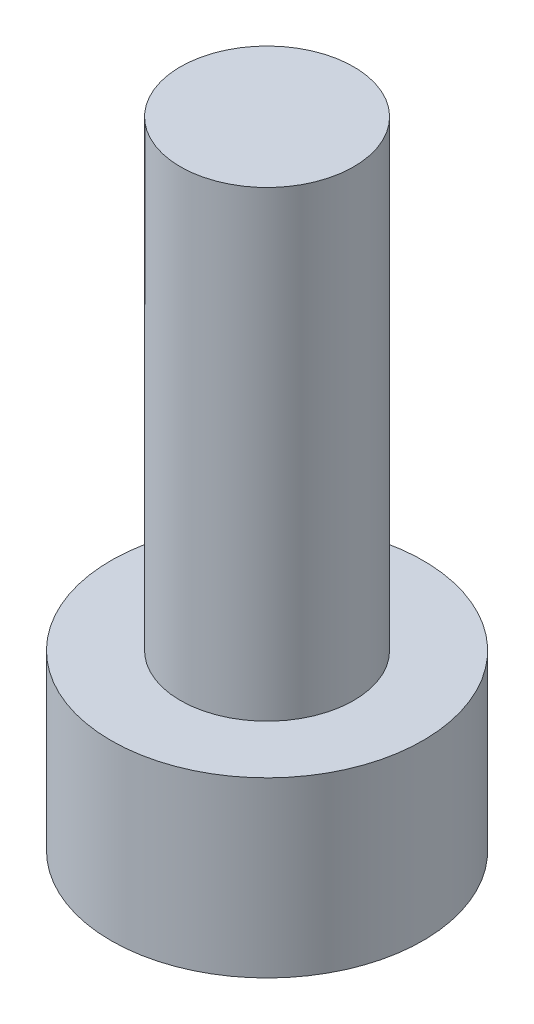
ISO-10303-21;
HEADER;
FILE_DESCRIPTION(('STEP AP214'),'2;1');
FILE_NAME('part.step','',(''),(''),'','','');
FILE_SCHEMA(('AUTOMOTIVE_DESIGN { 1 0 10303 214 1 1 1 1 }'));
ENDSEC;
DATA;
#1=APPLICATION_CONTEXT('core data for automotive mechanical design processes');
#2=APPLICATION_PROTOCOL_DEFINITION('international standard','automotive_design',2000,#1);
#3=PRODUCT_CONTEXT('',#1,'mechanical');
#4=PRODUCT('Part','Part','',(#3));
#5=PRODUCT_RELATED_PRODUCT_CATEGORY('part','',(#4));
#6=PRODUCT_DEFINITION_FORMATION('','',#4);
#7=PRODUCT_DEFINITION_CONTEXT('part definition',#1,'design');
#8=PRODUCT_DEFINITION('design','',#6,#7);
#9=PRODUCT_DEFINITION_SHAPE('','',#8);
#10=(LENGTH_UNIT() NAMED_UNIT(*) SI_UNIT(.MILLI.,.METRE.));
#11=(NAMED_UNIT(*) PLANE_ANGLE_UNIT() SI_UNIT($,.RADIAN.));
#12=(NAMED_UNIT(*) SI_UNIT($,.STERADIAN.) SOLID_ANGLE_UNIT());
#13=UNCERTAINTY_MEASURE_WITH_UNIT(LENGTH_MEASURE(1.E-05),#10,'distance_accuracy_value','');
#14=(GEOMETRIC_REPRESENTATION_CONTEXT(3) GLOBAL_UNCERTAINTY_ASSIGNED_CONTEXT((#13)) GLOBAL_UNIT_ASSIGNED_CONTEXT((#10,
#11,#12)) REPRESENTATION_CONTEXT('',''));
#15=CARTESIAN_POINT('',(0.,0.,0.));
#16=DIRECTION('',(0.,0.,1.));
#17=DIRECTION('',(1.,0.,0.));
#18=AXIS2_PLACEMENT_3D('',#15,#16,#17);
#19=CARTESIAN_POINT('',(0.,3.,0.));
#20=DIRECTION('',(0.,-1.,0.));
#21=DIRECTION('',(0.,0.,-1.));
#22=AXIS2_PLACEMENT_3D('',#19,#20,#21);
#23=CYLINDRICAL_SURFACE('',#22,2.7);
#24=CARTESIAN_POINT('',(0.,3.,0.));
#25=DIRECTION('',(0.,1.,0.));
#26=DIRECTION('',(0.,0.,1.));
#27=AXIS2_PLACEMENT_3D('',#24,#25,#26);
#28=CIRCLE('',#27,2.7);
#29=CARTESIAN_POINT('',(0.,3.,2.7));
#30=VERTEX_POINT('',#29);
#31=EDGE_CURVE('E10',#30,#30,#28,.T.);
#32=ORIENTED_EDGE('',*,*,#31,.F.);
#33=EDGE_LOOP('',(#32));
#34=FACE_BOUND('',#33,.T.);
#35=CARTESIAN_POINT('',(0.,0.,0.));
#36=DIRECTION('',(0.,1.,0.));
#37=DIRECTION('',(0.,0.,1.));
#38=AXIS2_PLACEMENT_3D('',#35,#36,#37);
#39=CIRCLE('',#38,2.7);
#40=CARTESIAN_POINT('',(0.,0.,2.7));
#41=VERTEX_POINT('',#40);
#42=EDGE_CURVE('E34',#41,#41,#39,.T.);
#43=ORIENTED_EDGE('',*,*,#42,.T.);
#44=EDGE_LOOP('',(#43));
#45=FACE_BOUND('',#44,.T.);
#46=ADVANCED_FACE('F31',(#34,#45),#23,.T.);
#47=CARTESIAN_POINT('',(0.,3.,0.));
#48=DIRECTION('',(0.,1.,0.));
#49=DIRECTION('',(0.,0.,1.));
#50=AXIS2_PLACEMENT_3D('',#47,#48,#49);
#51=PLANE('',#50);
#52=CARTESIAN_POINT('',(0.,3.,0.));
#53=DIRECTION('',(0.,1.,0.));
#54=DIRECTION('',(0.,0.,1.));
#55=AXIS2_PLACEMENT_3D('',#52,#53,#54);
#56=CIRCLE('',#55,1.5);
#57=CARTESIAN_POINT('',(0.,3.,1.5));
#58=VERTEX_POINT('',#57);
#59=EDGE_CURVE('E43',#58,#58,#56,.T.);
#60=ORIENTED_EDGE('',*,*,#59,.F.);
#61=EDGE_LOOP('',(#60));
#62=FACE_BOUND('',#61,.T.);
#63=ORIENTED_EDGE('',*,*,#31,.T.);
#64=EDGE_LOOP('',(#63));
#65=FACE_BOUND('',#64,.T.);
#66=ADVANCED_FACE('F58',(#62,#65),#51,.T.);
#67=CARTESIAN_POINT('',(0.,0.,0.));
#68=DIRECTION('',(0.,1.,0.));
#69=DIRECTION('',(0.,0.,1.));
#70=AXIS2_PLACEMENT_3D('',#67,#68,#69);
#71=PLANE('',#70);
#72=ORIENTED_EDGE('',*,*,#42,.F.);
#73=EDGE_LOOP('',(#72));
#74=FACE_BOUND('',#73,.T.);
#75=ADVANCED_FACE('F54',(#74),#71,.F.);
#76=CARTESIAN_POINT('',(0.,11.,0.));
#77=DIRECTION('',(0.,-1.,0.));
#78=DIRECTION('',(0.,0.,-1.));
#79=AXIS2_PLACEMENT_3D('',#76,#77,#78);
#80=CYLINDRICAL_SURFACE('',#79,1.5);
#81=CARTESIAN_POINT('',(0.,11.,0.));
#82=DIRECTION('',(0.,1.,0.));
#83=DIRECTION('',(0.,0.,1.));
#84=AXIS2_PLACEMENT_3D('',#81,#82,#83);
#85=CIRCLE('',#84,1.5);
#86=CARTESIAN_POINT('',(0.,11.,1.5));
#87=VERTEX_POINT('',#86);
#88=EDGE_CURVE('E41',#87,#87,#85,.T.);
#89=ORIENTED_EDGE('',*,*,#88,.F.);
#90=EDGE_LOOP('',(#89));
#91=FACE_BOUND('',#90,.T.);
#92=ORIENTED_EDGE('',*,*,#59,.T.);
#93=EDGE_LOOP('',(#92));
#94=FACE_BOUND('',#93,.T.);
#95=ADVANCED_FACE('F51',(#91,#94),#80,.T.);
#96=CARTESIAN_POINT('',(0.,11.,0.));
#97=DIRECTION('',(0.,1.,0.));
#98=DIRECTION('',(0.,0.,1.));
#99=AXIS2_PLACEMENT_3D('',#96,#97,#98);
#100=PLANE('',#99);
#101=ORIENTED_EDGE('',*,*,#88,.T.);
#102=EDGE_LOOP('',(#101));
#103=FACE_BOUND('',#102,.T.);
#104=ADVANCED_FACE('F49',(#103),#100,.T.);
#105=CLOSED_SHELL('',(#46,#66,#75,#95,#104));
#106=MANIFOLD_SOLID_BREP('B2',#105);
#107=ADVANCED_BREP_SHAPE_REPRESENTATION('',(#18,#106),#14);
#108=SHAPE_DEFINITION_REPRESENTATION(#9,#107);
ENDSEC;
END-ISO-10303-21;
